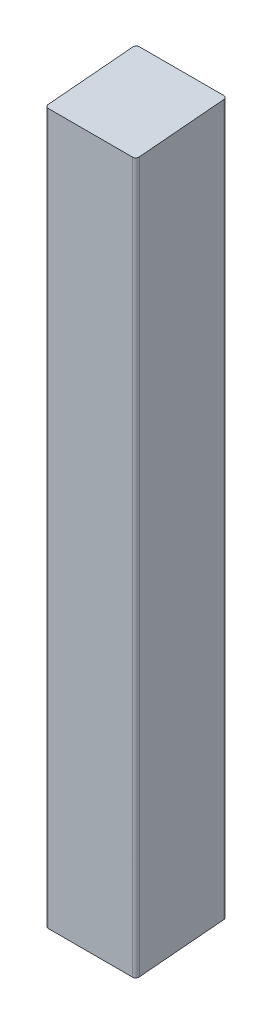
ISO-10303-21;
HEADER;
FILE_DESCRIPTION(('STEP AP214'),'2;1');
FILE_NAME('part.step','',(''),(''),'','','');
FILE_SCHEMA(('AUTOMOTIVE_DESIGN { 1 0 10303 214 1 1 1 1 }'));
ENDSEC;
DATA;
#1=APPLICATION_CONTEXT('core data for automotive mechanical design processes');
#2=APPLICATION_PROTOCOL_DEFINITION('international standard','automotive_design',2000,#1);
#3=PRODUCT_CONTEXT('',#1,'mechanical');
#4=PRODUCT('Part','Part','',(#3));
#5=PRODUCT_RELATED_PRODUCT_CATEGORY('part','',(#4));
#6=PRODUCT_DEFINITION_FORMATION('','',#4);
#7=PRODUCT_DEFINITION_CONTEXT('part definition',#1,'design');
#8=PRODUCT_DEFINITION('design','',#6,#7);
#9=PRODUCT_DEFINITION_SHAPE('','',#8);
#10=(LENGTH_UNIT() NAMED_UNIT(*) SI_UNIT(.MILLI.,.METRE.));
#11=(NAMED_UNIT(*) PLANE_ANGLE_UNIT() SI_UNIT($,.RADIAN.));
#12=(NAMED_UNIT(*) SI_UNIT($,.STERADIAN.) SOLID_ANGLE_UNIT());
#13=UNCERTAINTY_MEASURE_WITH_UNIT(LENGTH_MEASURE(1.E-05),#10,'distance_accuracy_value','');
#14=(GEOMETRIC_REPRESENTATION_CONTEXT(3) GLOBAL_UNCERTAINTY_ASSIGNED_CONTEXT((#13)) GLOBAL_UNIT_ASSIGNED_CONTEXT((#10,
#11,#12)) REPRESENTATION_CONTEXT('',''));
#15=CARTESIAN_POINT('',(0.,0.,0.));
#16=DIRECTION('',(0.,0.,1.));
#17=DIRECTION('',(1.,0.,0.));
#18=AXIS2_PLACEMENT_3D('',#15,#16,#17);
#19=CARTESIAN_POINT('',(44.45,7.777742187455,-88.9000000000001));
#20=DIRECTION('',(0.,0.996194698091745,0.087155742747662));
#21=DIRECTION('',(0.,-0.087155742747662,0.996194698091745));
#22=AXIS2_PLACEMENT_3D('',#19,#20,#21);
#23=PLANE('',#22);
#24=DIRECTION('',(0.,0.087155742747662,-0.996194698091745));
#25=VECTOR('',#24,1.);
#26=CARTESIAN_POINT('',(-44.45,7.777742187455,-88.9000000000001));
#27=LINE('',#26,#25);
#28=CARTESIAN_POINT('',(-44.45,0.277776506694822,-3.175));
#29=VERTEX_POINT('',#28);
#30=CARTESIAN_POINT('',(-44.45,7.49996568076018,-85.7250000000001));
#31=VERTEX_POINT('',#30);
#32=EDGE_CURVE('E167',#29,#31,#27,.T.);
#33=ORIENTED_EDGE('',*,*,#32,.T.);
#34=CARTESIAN_POINT('',(-41.275,7.49996568076017,-85.7250000000001));
#35=DIRECTION('',(0.,0.996194698091745,0.087155742747662));
#36=DIRECTION('',(0.,-0.087155742747662,0.996194698091745));
#37=AXIS2_PLACEMENT_3D('',#34,#35,#36);
#38=ELLIPSE('',#37,3.18712798420013,3.175);
#39=CARTESIAN_POINT('',(-41.275,7.777742187455,-88.9000000000001));
#40=VERTEX_POINT('',#39);
#41=EDGE_CURVE('E141',#31,#40,#38,.F.);
#42=ORIENTED_EDGE('',*,*,#41,.T.);
#43=DIRECTION('',(-1.,0.,0.));
#44=VECTOR('',#43,1.);
#45=CARTESIAN_POINT('',(44.45,7.777742187455,-88.9000000000001));
#46=LINE('',#45,#44);
#47=CARTESIAN_POINT('',(41.275,7.777742187455,-88.9000000000001));
#48=VERTEX_POINT('',#47);
#49=EDGE_CURVE('E120',#48,#40,#46,.T.);
#50=ORIENTED_EDGE('',*,*,#49,.F.);
#51=CARTESIAN_POINT('',(41.275,7.49996568076018,-85.7250000000001));
#52=DIRECTION('',(0.,0.996194698091745,0.087155742747662));
#53=DIRECTION('',(0.,0.087155742747662,-0.996194698091745));
#54=AXIS2_PLACEMENT_3D('',#51,#52,#53);
#55=ELLIPSE('',#54,3.18712798420013,3.175);
#56=CARTESIAN_POINT('',(44.45,7.49996568076018,-85.7250000000001));
#57=VERTEX_POINT('',#56);
#58=EDGE_CURVE('E125',#48,#57,#55,.F.);
#59=ORIENTED_EDGE('',*,*,#58,.T.);
#60=DIRECTION('',(0.,0.087155742747662,-0.996194698091745));
#61=VECTOR('',#60,1.);
#62=CARTESIAN_POINT('',(44.45,7.777742187455,-88.9000000000001));
#63=LINE('',#62,#61);
#64=CARTESIAN_POINT('',(44.45,0.277776506694822,-3.175));
#65=VERTEX_POINT('',#64);
#66=EDGE_CURVE('E162',#65,#57,#63,.T.);
#67=ORIENTED_EDGE('',*,*,#66,.F.);
#68=CARTESIAN_POINT('',(41.275,0.277776506694822,-3.175));
#69=DIRECTION('',(0.,0.996194698091745,0.087155742747662));
#70=DIRECTION('',(0.,-0.087155742747662,0.996194698091745));
#71=AXIS2_PLACEMENT_3D('',#68,#69,#70);
#72=ELLIPSE('',#71,3.18712798420013,3.175);
#73=CARTESIAN_POINT('',(41.275,0.,0.));
#74=VERTEX_POINT('',#73);
#75=EDGE_CURVE('E55',#65,#74,#72,.F.);
#76=ORIENTED_EDGE('',*,*,#75,.T.);
#77=DIRECTION('',(-1.,0.,0.));
#78=VECTOR('',#77,1.);
#79=CARTESIAN_POINT('',(44.45,0.,0.));
#80=LINE('',#79,#78);
#81=CARTESIAN_POINT('',(-41.275,0.,0.));
#82=VERTEX_POINT('',#81);
#83=EDGE_CURVE('E152',#74,#82,#80,.T.);
#84=ORIENTED_EDGE('',*,*,#83,.T.);
#85=CARTESIAN_POINT('',(-41.275,0.277776506694822,-3.175));
#86=DIRECTION('',(0.,0.996194698091745,0.087155742747662));
#87=DIRECTION('',(0.,0.087155742747662,-0.996194698091745));
#88=AXIS2_PLACEMENT_3D('',#85,#86,#87);
#89=ELLIPSE('',#88,3.18712798420013,3.175);
#90=EDGE_CURVE('E48',#82,#29,#89,.F.);
#91=ORIENTED_EDGE('',*,*,#90,.T.);
#92=EDGE_LOOP('',(#33,#42,#50,#59,#67,#76,#84,#91));
#93=FACE_BOUND('',#92,.T.);
#94=ADVANCED_FACE('F33',(#93),#23,.F.);
#95=CARTESIAN_POINT('',(44.45,701.515242187455,-88.9));
#96=DIRECTION('',(0.,0.,1.));
#97=DIRECTION('',(0.,-1.,0.));
#98=AXIS2_PLACEMENT_3D('',#95,#96,#97);
#99=PLANE('',#98);
#100=ORIENTED_EDGE('',*,*,#49,.T.);
#101=DIRECTION('',(0.,1.,0.));
#102=VECTOR('',#101,1.);
#103=CARTESIAN_POINT('',(-41.275,701.515242187455,-88.9));
#104=LINE('',#103,#102);
#105=CARTESIAN_POINT('',(-41.275,701.515242187455,-88.9));
#106=VERTEX_POINT('',#105);
#107=EDGE_CURVE('E119',#40,#106,#104,.T.);
#108=ORIENTED_EDGE('',*,*,#107,.T.);
#109=DIRECTION('',(-1.,0.,0.));
#110=VECTOR('',#109,1.);
#111=CARTESIAN_POINT('',(44.45,701.515242187455,-88.9));
#112=LINE('',#111,#110);
#113=CARTESIAN_POINT('',(41.275,701.515242187455,-88.9));
#114=VERTEX_POINT('',#113);
#115=EDGE_CURVE('E102',#114,#106,#112,.T.);
#116=ORIENTED_EDGE('',*,*,#115,.F.);
#117=DIRECTION('',(0.,1.,0.));
#118=VECTOR('',#117,1.);
#119=CARTESIAN_POINT('',(41.275,701.515242187455,-88.9));
#120=LINE('',#119,#118);
#121=EDGE_CURVE('E116',#114,#48,#120,.F.);
#122=ORIENTED_EDGE('',*,*,#121,.T.);
#123=EDGE_LOOP('',(#100,#108,#116,#122));
#124=FACE_BOUND('',#123,.T.);
#125=ADVANCED_FACE('F115',(#124),#99,.F.);
#126=CARTESIAN_POINT('',(44.45,693.7375,0.));
#127=DIRECTION('',(0.,-0.996194698091745,-0.0871557427476618));
#128=DIRECTION('',(0.,0.0871557427476618,-0.996194698091745));
#129=AXIS2_PLACEMENT_3D('',#126,#127,#128);
#130=PLANE('',#129);
#131=ORIENTED_EDGE('',*,*,#115,.T.);
#132=CARTESIAN_POINT('',(-41.275,701.23746568076,-85.725));
#133=DIRECTION('',(0.,-0.996194698091745,-0.0871557427476618));
#134=DIRECTION('',(0.,-0.0871557427476618,0.996194698091745));
#135=AXIS2_PLACEMENT_3D('',#132,#133,#134);
#136=ELLIPSE('',#135,3.18712798420013,3.175);
#137=CARTESIAN_POINT('',(-44.45,701.23746568076,-85.725));
#138=VERTEX_POINT('',#137);
#139=EDGE_CURVE('E109',#106,#138,#136,.F.);
#140=ORIENTED_EDGE('',*,*,#139,.T.);
#141=DIRECTION('',(0.,-0.0871557427476618,0.996194698091745));
#142=VECTOR('',#141,1.);
#143=CARTESIAN_POINT('',(-44.45,693.7375,0.));
#144=LINE('',#143,#142);
#145=CARTESIAN_POINT('',(-44.45,694.015276506695,-3.175));
#146=VERTEX_POINT('',#145);
#147=EDGE_CURVE('E164',#138,#146,#144,.T.);
#148=ORIENTED_EDGE('',*,*,#147,.T.);
#149=CARTESIAN_POINT('',(-41.275,694.015276506695,-3.175));
#150=DIRECTION('',(0.,-0.996194698091745,-0.0871557427476618));
#151=DIRECTION('',(0.,0.0871557427476618,-0.996194698091745));
#152=AXIS2_PLACEMENT_3D('',#149,#150,#151);
#153=ELLIPSE('',#152,3.18712798420013,3.175);
#154=CARTESIAN_POINT('',(-41.275,693.7375,0.));
#155=VERTEX_POINT('',#154);
#156=EDGE_CURVE('E110',#146,#155,#153,.F.);
#157=ORIENTED_EDGE('',*,*,#156,.T.);
#158=DIRECTION('',(-1.,0.,0.));
#159=VECTOR('',#158,1.);
#160=CARTESIAN_POINT('',(44.45,693.7375,0.));
#161=LINE('',#160,#159);
#162=CARTESIAN_POINT('',(41.275,693.7375,0.));
#163=VERTEX_POINT('',#162);
#164=EDGE_CURVE('E121',#163,#155,#161,.T.);
#165=ORIENTED_EDGE('',*,*,#164,.F.);
#166=CARTESIAN_POINT('',(41.275,694.015276506695,-3.175));
#167=DIRECTION('',(0.,-0.996194698091745,-0.0871557427476618));
#168=DIRECTION('',(0.,-0.0871557427476618,0.996194698091745));
#169=AXIS2_PLACEMENT_3D('',#166,#167,#168);
#170=ELLIPSE('',#169,3.18712798420013,3.175);
#171=CARTESIAN_POINT('',(44.45,694.015276506695,-3.175));
#172=VERTEX_POINT('',#171);
#173=EDGE_CURVE('E127',#163,#172,#170,.F.);
#174=ORIENTED_EDGE('',*,*,#173,.T.);
#175=DIRECTION('',(0.,-0.0871557427476618,0.996194698091745));
#176=VECTOR('',#175,1.);
#177=CARTESIAN_POINT('',(44.45,693.7375,0.));
#178=LINE('',#177,#176);
#179=CARTESIAN_POINT('',(44.45,701.23746568076,-85.725));
#180=VERTEX_POINT('',#179);
#181=EDGE_CURVE('E104',#180,#172,#178,.T.);
#182=ORIENTED_EDGE('',*,*,#181,.F.);
#183=CARTESIAN_POINT('',(41.275,701.23746568076,-85.725));
#184=DIRECTION('',(0.,-0.996194698091745,-0.0871557427476618));
#185=DIRECTION('',(0.,0.0871557427476618,-0.996194698091745));
#186=AXIS2_PLACEMENT_3D('',#183,#184,#185);
#187=ELLIPSE('',#186,3.18712798420013,3.175);
#188=EDGE_CURVE('E99',#180,#114,#187,.F.);
#189=ORIENTED_EDGE('',*,*,#188,.T.);
#190=EDGE_LOOP('',(#131,#140,#148,#157,#165,#174,#182,#189));
#191=FACE_BOUND('',#190,.T.);
#192=ADVANCED_FACE('F101',(#191),#130,.F.);
#193=CARTESIAN_POINT('',(44.45,0.,0.));
#194=DIRECTION('',(0.,0.,-1.));
#195=DIRECTION('',(-1.,0.,0.));
#196=AXIS2_PLACEMENT_3D('',#193,#194,#195);
#197=PLANE('',#196);
#198=ORIENTED_EDGE('',*,*,#164,.T.);
#199=DIRECTION('',(0.,-1.,0.));
#200=VECTOR('',#199,1.);
#201=CARTESIAN_POINT('',(-41.275,0.,0.));
#202=LINE('',#201,#200);
#203=EDGE_CURVE('E11',#155,#82,#202,.T.);
#204=ORIENTED_EDGE('',*,*,#203,.T.);
#205=ORIENTED_EDGE('',*,*,#83,.F.);
#206=DIRECTION('',(0.,-1.,0.));
#207=VECTOR('',#206,1.);
#208=CARTESIAN_POINT('',(41.275,0.,0.));
#209=LINE('',#208,#207);
#210=EDGE_CURVE('E41',#74,#163,#209,.F.);
#211=ORIENTED_EDGE('',*,*,#210,.T.);
#212=EDGE_LOOP('',(#198,#204,#205,#211));
#213=FACE_BOUND('',#212,.T.);
#214=ADVANCED_FACE('F151',(#213),#197,.F.);
#215=CARTESIAN_POINT('',(44.45,0.,0.));
#216=DIRECTION('',(-1.,0.,0.));
#217=DIRECTION('',(0.,0.,1.));
#218=AXIS2_PLACEMENT_3D('',#215,#216,#217);
#219=PLANE('',#218);
#220=ORIENTED_EDGE('',*,*,#66,.T.);
#221=DIRECTION('',(0.,1.,0.));
#222=VECTOR('',#221,1.);
#223=CARTESIAN_POINT('',(44.45,0.,-85.7250000000001));
#224=LINE('',#223,#222);
#225=EDGE_CURVE('E146',#57,#180,#224,.T.);
#226=ORIENTED_EDGE('',*,*,#225,.T.);
#227=ORIENTED_EDGE('',*,*,#181,.T.);
#228=DIRECTION('',(0.,-1.,0.));
#229=VECTOR('',#228,1.);
#230=CARTESIAN_POINT('',(44.45,0.,-3.175));
#231=LINE('',#230,#229);
#232=EDGE_CURVE('E143',#172,#65,#231,.T.);
#233=ORIENTED_EDGE('',*,*,#232,.T.);
#234=EDGE_LOOP('',(#220,#226,#227,#233));
#235=FACE_BOUND('',#234,.T.);
#236=ADVANCED_FACE('F161',(#235),#219,.F.);
#237=CARTESIAN_POINT('',(-44.45,0.,0.));
#238=DIRECTION('',(-1.,0.,0.));
#239=DIRECTION('',(0.,0.,1.));
#240=AXIS2_PLACEMENT_3D('',#237,#238,#239);
#241=PLANE('',#240);
#242=ORIENTED_EDGE('',*,*,#147,.F.);
#243=DIRECTION('',(0.,1.,0.));
#244=VECTOR('',#243,1.);
#245=CARTESIAN_POINT('',(-44.45,7.77774218745497,-85.7250000000001));
#246=LINE('',#245,#244);
#247=EDGE_CURVE('E136',#138,#31,#246,.F.);
#248=ORIENTED_EDGE('',*,*,#247,.T.);
#249=ORIENTED_EDGE('',*,*,#32,.F.);
#250=DIRECTION('',(0.,-1.,0.));
#251=VECTOR('',#250,1.);
#252=CARTESIAN_POINT('',(-44.45,693.7375,-3.175));
#253=LINE('',#252,#251);
#254=EDGE_CURVE('E134',#29,#146,#253,.F.);
#255=ORIENTED_EDGE('',*,*,#254,.T.);
#256=EDGE_LOOP('',(#242,#248,#249,#255));
#257=FACE_BOUND('',#256,.T.);
#258=ADVANCED_FACE('F175',(#257),#241,.T.);
#259=CARTESIAN_POINT('',(-41.275,701.515242187455,-85.725));
#260=DIRECTION('',(0.,-1.,0.));
#261=DIRECTION('',(0.,0.,-1.));
#262=AXIS2_PLACEMENT_3D('',#259,#260,#261);
#263=CYLINDRICAL_SURFACE('',#262,3.175);
#264=ORIENTED_EDGE('',*,*,#41,.F.);
#265=ORIENTED_EDGE('',*,*,#247,.F.);
#266=ORIENTED_EDGE('',*,*,#139,.F.);
#267=ORIENTED_EDGE('',*,*,#107,.F.);
#268=EDGE_LOOP('',(#264,#265,#266,#267));
#269=FACE_BOUND('',#268,.T.);
#270=ADVANCED_FACE('F183',(#269),#263,.T.);
#271=CARTESIAN_POINT('',(41.275,0.,-85.7250000000001));
#272=DIRECTION('',(0.,1.,0.));
#273=DIRECTION('',(0.,0.,1.));
#274=AXIS2_PLACEMENT_3D('',#271,#272,#273);
#275=CYLINDRICAL_SURFACE('',#274,3.175);
#276=ORIENTED_EDGE('',*,*,#58,.F.);
#277=ORIENTED_EDGE('',*,*,#121,.F.);
#278=ORIENTED_EDGE('',*,*,#188,.F.);
#279=ORIENTED_EDGE('',*,*,#225,.F.);
#280=EDGE_LOOP('',(#276,#277,#278,#279));
#281=FACE_BOUND('',#280,.T.);
#282=ADVANCED_FACE('F124',(#281),#275,.T.);
#283=CARTESIAN_POINT('',(-41.275,0.,-3.175));
#284=DIRECTION('',(0.,1.,0.));
#285=DIRECTION('',(0.,0.,1.));
#286=AXIS2_PLACEMENT_3D('',#283,#284,#285);
#287=CYLINDRICAL_SURFACE('',#286,3.175);
#288=ORIENTED_EDGE('',*,*,#156,.F.);
#289=ORIENTED_EDGE('',*,*,#254,.F.);
#290=ORIENTED_EDGE('',*,*,#90,.F.);
#291=ORIENTED_EDGE('',*,*,#203,.F.);
#292=EDGE_LOOP('',(#288,#289,#290,#291));
#293=FACE_BOUND('',#292,.T.);
#294=ADVANCED_FACE('F177',(#293),#287,.T.);
#295=CARTESIAN_POINT('',(41.275,0.,-3.175));
#296=DIRECTION('',(0.,-1.,0.));
#297=DIRECTION('',(0.,0.,-1.));
#298=AXIS2_PLACEMENT_3D('',#295,#296,#297);
#299=CYLINDRICAL_SURFACE('',#298,3.175);
#300=ORIENTED_EDGE('',*,*,#173,.F.);
#301=ORIENTED_EDGE('',*,*,#210,.F.);
#302=ORIENTED_EDGE('',*,*,#75,.F.);
#303=ORIENTED_EDGE('',*,*,#232,.F.);
#304=EDGE_LOOP('',(#300,#301,#302,#303));
#305=FACE_BOUND('',#304,.T.);
#306=ADVANCED_FACE('F35',(#305),#299,.T.);
#307=CLOSED_SHELL('',(#94,#125,#192,#214,#236,#258,#270,#282,#294,#306));
#308=MANIFOLD_SOLID_BREP('B2',#307);
#309=ADVANCED_BREP_SHAPE_REPRESENTATION('',(#18,#308),#14);
#310=SHAPE_DEFINITION_REPRESENTATION(#9,#309);
ENDSEC;
END-ISO-10303-21;
